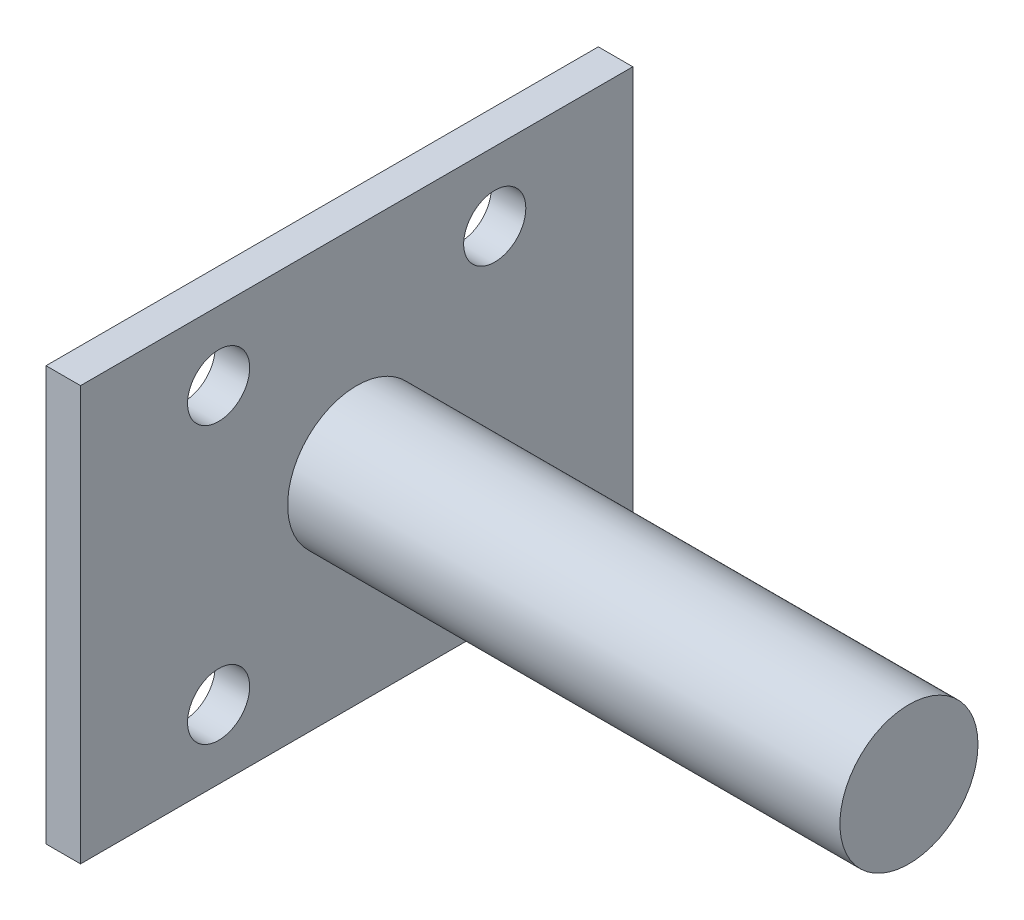
ISO-10303-21;
HEADER;
FILE_DESCRIPTION(('STEP AP214'),'2;1');
FILE_NAME('part.step','',(''),(''),'','','');
FILE_SCHEMA(('AUTOMOTIVE_DESIGN { 1 0 10303 214 1 1 1 1 }'));
ENDSEC;
DATA;
#1=APPLICATION_CONTEXT('core data for automotive mechanical design processes');
#2=APPLICATION_PROTOCOL_DEFINITION('international standard','automotive_design',2000,#1);
#3=PRODUCT_CONTEXT('',#1,'mechanical');
#4=PRODUCT('Part','Part','',(#3));
#5=PRODUCT_RELATED_PRODUCT_CATEGORY('part','',(#4));
#6=PRODUCT_DEFINITION_FORMATION('','',#4);
#7=PRODUCT_DEFINITION_CONTEXT('part definition',#1,'design');
#8=PRODUCT_DEFINITION('design','',#6,#7);
#9=PRODUCT_DEFINITION_SHAPE('','',#8);
#10=(LENGTH_UNIT() NAMED_UNIT(*) SI_UNIT(.MILLI.,.METRE.));
#11=(NAMED_UNIT(*) PLANE_ANGLE_UNIT() SI_UNIT($,.RADIAN.));
#12=(NAMED_UNIT(*) SI_UNIT($,.STERADIAN.) SOLID_ANGLE_UNIT());
#13=UNCERTAINTY_MEASURE_WITH_UNIT(LENGTH_MEASURE(1.E-05),#10,'distance_accuracy_value','');
#14=(GEOMETRIC_REPRESENTATION_CONTEXT(3) GLOBAL_UNCERTAINTY_ASSIGNED_CONTEXT((#13)) GLOBAL_UNIT_ASSIGNED_CONTEXT((#10,
#11,#12)) REPRESENTATION_CONTEXT('',''));
#15=CARTESIAN_POINT('',(0.,0.,0.));
#16=DIRECTION('',(0.,0.,1.));
#17=DIRECTION('',(1.,0.,0.));
#18=AXIS2_PLACEMENT_3D('',#15,#16,#17);
#19=CARTESIAN_POINT('',(2.5,-15.,20.));
#20=DIRECTION('',(0.,0.,-1.));
#21=DIRECTION('',(-1.,0.,0.));
#22=AXIS2_PLACEMENT_3D('',#19,#20,#21);
#23=PLANE('',#22);
#24=DIRECTION('',(0.,-1.,0.));
#25=VECTOR('',#24,1.);
#26=CARTESIAN_POINT('',(0.,-15.,20.));
#27=LINE('',#26,#25);
#28=CARTESIAN_POINT('',(0.,15.,20.));
#29=VERTEX_POINT('',#28);
#30=CARTESIAN_POINT('',(0.,-15.,20.));
#31=VERTEX_POINT('',#30);
#32=EDGE_CURVE('E116',#29,#31,#27,.T.);
#33=ORIENTED_EDGE('',*,*,#32,.T.);
#34=DIRECTION('',(-1.,0.,0.));
#35=VECTOR('',#34,1.);
#36=CARTESIAN_POINT('',(2.5,-15.,20.));
#37=LINE('',#36,#35);
#38=CARTESIAN_POINT('',(2.5,-15.,20.));
#39=VERTEX_POINT('',#38);
#40=EDGE_CURVE('E48',#39,#31,#37,.T.);
#41=ORIENTED_EDGE('',*,*,#40,.F.);
#42=DIRECTION('',(0.,-1.,0.));
#43=VECTOR('',#42,1.);
#44=CARTESIAN_POINT('',(2.5,-15.,20.));
#45=LINE('',#44,#43);
#46=CARTESIAN_POINT('',(2.5,15.,20.));
#47=VERTEX_POINT('',#46);
#48=EDGE_CURVE('E99',#47,#39,#45,.T.);
#49=ORIENTED_EDGE('',*,*,#48,.F.);
#50=DIRECTION('',(-1.,0.,0.));
#51=VECTOR('',#50,1.);
#52=CARTESIAN_POINT('',(2.5,15.,20.));
#53=LINE('',#52,#51);
#54=EDGE_CURVE('E112',#47,#29,#53,.T.);
#55=ORIENTED_EDGE('',*,*,#54,.T.);
#56=EDGE_LOOP('',(#33,#41,#49,#55));
#57=FACE_BOUND('',#56,.T.);
#58=ADVANCED_FACE('F45',(#57),#23,.F.);
#59=CARTESIAN_POINT('',(2.5,-15.,-20.));
#60=DIRECTION('',(0.,1.,0.));
#61=DIRECTION('',(0.,0.,1.));
#62=AXIS2_PLACEMENT_3D('',#59,#60,#61);
#63=PLANE('',#62);
#64=DIRECTION('',(0.,0.,-1.));
#65=VECTOR('',#64,1.);
#66=CARTESIAN_POINT('',(0.,-15.,-20.));
#67=LINE('',#66,#65);
#68=CARTESIAN_POINT('',(0.,-15.,-20.));
#69=VERTEX_POINT('',#68);
#70=EDGE_CURVE('E105',#31,#69,#67,.T.);
#71=ORIENTED_EDGE('',*,*,#70,.T.);
#72=DIRECTION('',(-1.,0.,0.));
#73=VECTOR('',#72,1.);
#74=CARTESIAN_POINT('',(2.5,-15.,-20.));
#75=LINE('',#74,#73);
#76=CARTESIAN_POINT('',(2.5,-15.,-20.));
#77=VERTEX_POINT('',#76);
#78=EDGE_CURVE('E103',#77,#69,#75,.T.);
#79=ORIENTED_EDGE('',*,*,#78,.F.);
#80=DIRECTION('',(0.,0.,-1.));
#81=VECTOR('',#80,1.);
#82=CARTESIAN_POINT('',(2.5,-15.,-20.));
#83=LINE('',#82,#81);
#84=EDGE_CURVE('E94',#39,#77,#83,.T.);
#85=ORIENTED_EDGE('',*,*,#84,.F.);
#86=ORIENTED_EDGE('',*,*,#40,.T.);
#87=EDGE_LOOP('',(#71,#79,#85,#86));
#88=FACE_BOUND('',#87,.T.);
#89=ADVANCED_FACE('F104',(#88),#63,.F.);
#90=CARTESIAN_POINT('',(2.5,-15.,-20.));
#91=DIRECTION('',(0.,0.,1.));
#92=DIRECTION('',(0.,-1.,0.));
#93=AXIS2_PLACEMENT_3D('',#90,#91,#92);
#94=PLANE('',#93);
#95=DIRECTION('',(0.,1.,0.));
#96=VECTOR('',#95,1.);
#97=CARTESIAN_POINT('',(0.,-15.,-20.));
#98=LINE('',#97,#96);
#99=CARTESIAN_POINT('',(0.,15.,-20.));
#100=VERTEX_POINT('',#99);
#101=EDGE_CURVE('E80',#69,#100,#98,.T.);
#102=ORIENTED_EDGE('',*,*,#101,.T.);
#103=DIRECTION('',(-1.,0.,0.));
#104=VECTOR('',#103,1.);
#105=CARTESIAN_POINT('',(2.5,15.,-20.));
#106=LINE('',#105,#104);
#107=CARTESIAN_POINT('',(2.5,15.,-20.));
#108=VERTEX_POINT('',#107);
#109=EDGE_CURVE('E107',#108,#100,#106,.T.);
#110=ORIENTED_EDGE('',*,*,#109,.F.);
#111=DIRECTION('',(0.,1.,0.));
#112=VECTOR('',#111,1.);
#113=CARTESIAN_POINT('',(2.5,-15.,-20.));
#114=LINE('',#113,#112);
#115=EDGE_CURVE('E97',#77,#108,#114,.T.);
#116=ORIENTED_EDGE('',*,*,#115,.F.);
#117=ORIENTED_EDGE('',*,*,#78,.T.);
#118=EDGE_LOOP('',(#102,#110,#116,#117));
#119=FACE_BOUND('',#118,.T.);
#120=ADVANCED_FACE('F108',(#119),#94,.F.);
#121=CARTESIAN_POINT('',(2.5,15.,-20.));
#122=DIRECTION('',(0.,-1.,0.));
#123=DIRECTION('',(0.,0.,-1.));
#124=AXIS2_PLACEMENT_3D('',#121,#122,#123);
#125=PLANE('',#124);
#126=DIRECTION('',(0.,0.,1.));
#127=VECTOR('',#126,1.);
#128=CARTESIAN_POINT('',(0.,15.,-20.));
#129=LINE('',#128,#127);
#130=EDGE_CURVE('E86',#100,#29,#129,.T.);
#131=ORIENTED_EDGE('',*,*,#130,.T.);
#132=ORIENTED_EDGE('',*,*,#54,.F.);
#133=DIRECTION('',(0.,0.,1.));
#134=VECTOR('',#133,1.);
#135=CARTESIAN_POINT('',(2.5,15.,-20.));
#136=LINE('',#135,#134);
#137=EDGE_CURVE('E63',#108,#47,#136,.T.);
#138=ORIENTED_EDGE('',*,*,#137,.F.);
#139=ORIENTED_EDGE('',*,*,#109,.T.);
#140=EDGE_LOOP('',(#131,#132,#138,#139));
#141=FACE_BOUND('',#140,.T.);
#142=ADVANCED_FACE('F130',(#141),#125,.F.);
#143=CARTESIAN_POINT('',(2.5,0.,0.));
#144=DIRECTION('',(1.,0.,0.));
#145=DIRECTION('',(0.,0.,-1.));
#146=AXIS2_PLACEMENT_3D('',#143,#144,#145);
#147=PLANE('',#146);
#148=CARTESIAN_POINT('',(2.5,-9.99999999999999,10.));
#149=DIRECTION('',(1.,0.,0.));
#150=DIRECTION('',(0.,0.,-1.));
#151=AXIS2_PLACEMENT_3D('',#148,#149,#150);
#152=CIRCLE('',#151,2.25);
#153=CARTESIAN_POINT('',(2.5,-9.99999999999999,7.75000000000001));
#154=VERTEX_POINT('',#153);
#155=EDGE_CURVE('E145',#154,#154,#152,.T.);
#156=ORIENTED_EDGE('',*,*,#155,.F.);
#157=EDGE_LOOP('',(#156));
#158=FACE_BOUND('',#157,.T.);
#159=CARTESIAN_POINT('',(2.5,10.,-10.));
#160=DIRECTION('',(1.,0.,0.));
#161=DIRECTION('',(0.,0.,-1.));
#162=AXIS2_PLACEMENT_3D('',#159,#160,#161);
#163=CIRCLE('',#162,2.25);
#164=CARTESIAN_POINT('',(2.5,10.,-12.25));
#165=VERTEX_POINT('',#164);
#166=EDGE_CURVE('E153',#165,#165,#163,.T.);
#167=ORIENTED_EDGE('',*,*,#166,.F.);
#168=EDGE_LOOP('',(#167));
#169=FACE_BOUND('',#168,.T.);
#170=CARTESIAN_POINT('',(2.5,-9.99999999999999,-10.));
#171=DIRECTION('',(1.,0.,0.));
#172=DIRECTION('',(0.,0.,-1.));
#173=AXIS2_PLACEMENT_3D('',#170,#171,#172);
#174=CIRCLE('',#173,2.25);
#175=CARTESIAN_POINT('',(2.5,-9.99999999999999,-12.25));
#176=VERTEX_POINT('',#175);
#177=EDGE_CURVE('E154',#176,#176,#174,.T.);
#178=ORIENTED_EDGE('',*,*,#177,.F.);
#179=EDGE_LOOP('',(#178));
#180=FACE_BOUND('',#179,.T.);
#181=CARTESIAN_POINT('',(2.5,10.,10.));
#182=DIRECTION('',(1.,0.,0.));
#183=DIRECTION('',(0.,0.,-1.));
#184=AXIS2_PLACEMENT_3D('',#181,#182,#183);
#185=CIRCLE('',#184,2.25);
#186=CARTESIAN_POINT('',(2.5,10.,7.75000000000001));
#187=VERTEX_POINT('',#186);
#188=EDGE_CURVE('E141',#187,#187,#185,.T.);
#189=ORIENTED_EDGE('',*,*,#188,.F.);
#190=EDGE_LOOP('',(#189));
#191=FACE_BOUND('',#190,.T.);
#192=CARTESIAN_POINT('',(2.5,0.,0.));
#193=DIRECTION('',(1.,0.,0.));
#194=DIRECTION('',(0.,0.,-1.));
#195=AXIS2_PLACEMENT_3D('',#192,#193,#194);
#196=CIRCLE('',#195,5.);
#197=CARTESIAN_POINT('',(2.5,0.,-5.));
#198=VERTEX_POINT('',#197);
#199=EDGE_CURVE('E11',#198,#198,#196,.T.);
#200=ORIENTED_EDGE('',*,*,#199,.F.);
#201=EDGE_LOOP('',(#200));
#202=FACE_BOUND('',#201,.T.);
#203=ORIENTED_EDGE('',*,*,#48,.T.);
#204=ORIENTED_EDGE('',*,*,#84,.T.);
#205=ORIENTED_EDGE('',*,*,#115,.T.);
#206=ORIENTED_EDGE('',*,*,#137,.T.);
#207=EDGE_LOOP('',(#203,#204,#205,#206));
#208=FACE_BOUND('',#207,.T.);
#209=ADVANCED_FACE('F95',(#158,#169,#180,#191,#202,#208),#147,.T.);
#210=CARTESIAN_POINT('',(0.,0.,0.));
#211=DIRECTION('',(1.,0.,0.));
#212=DIRECTION('',(0.,0.,-1.));
#213=AXIS2_PLACEMENT_3D('',#210,#211,#212);
#214=PLANE('',#213);
#215=CARTESIAN_POINT('',(0.,-9.99999999999999,10.));
#216=DIRECTION('',(1.,0.,0.));
#217=DIRECTION('',(0.,0.,-1.));
#218=AXIS2_PLACEMENT_3D('',#215,#216,#217);
#219=CIRCLE('',#218,2.25);
#220=CARTESIAN_POINT('',(0.,-9.99999999999999,7.75000000000001));
#221=VERTEX_POINT('',#220);
#222=EDGE_CURVE('E158',#221,#221,#219,.T.);
#223=ORIENTED_EDGE('',*,*,#222,.T.);
#224=EDGE_LOOP('',(#223));
#225=FACE_BOUND('',#224,.T.);
#226=CARTESIAN_POINT('',(0.,10.,-10.));
#227=DIRECTION('',(1.,0.,0.));
#228=DIRECTION('',(0.,0.,-1.));
#229=AXIS2_PLACEMENT_3D('',#226,#227,#228);
#230=CIRCLE('',#229,2.25);
#231=CARTESIAN_POINT('',(0.,10.,-12.25));
#232=VERTEX_POINT('',#231);
#233=EDGE_CURVE('E149',#232,#232,#230,.T.);
#234=ORIENTED_EDGE('',*,*,#233,.T.);
#235=EDGE_LOOP('',(#234));
#236=FACE_BOUND('',#235,.T.);
#237=CARTESIAN_POINT('',(0.,-9.99999999999999,-10.));
#238=DIRECTION('',(1.,0.,0.));
#239=DIRECTION('',(0.,0.,-1.));
#240=AXIS2_PLACEMENT_3D('',#237,#238,#239);
#241=CIRCLE('',#240,2.25);
#242=CARTESIAN_POINT('',(0.,-9.99999999999999,-12.25));
#243=VERTEX_POINT('',#242);
#244=EDGE_CURVE('E165',#243,#243,#241,.T.);
#245=ORIENTED_EDGE('',*,*,#244,.T.);
#246=EDGE_LOOP('',(#245));
#247=FACE_BOUND('',#246,.T.);
#248=CARTESIAN_POINT('',(0.,10.,10.));
#249=DIRECTION('',(1.,0.,0.));
#250=DIRECTION('',(0.,0.,-1.));
#251=AXIS2_PLACEMENT_3D('',#248,#249,#250);
#252=CIRCLE('',#251,2.25);
#253=CARTESIAN_POINT('',(0.,10.,7.75000000000001));
#254=VERTEX_POINT('',#253);
#255=EDGE_CURVE('E140',#254,#254,#252,.T.);
#256=ORIENTED_EDGE('',*,*,#255,.T.);
#257=EDGE_LOOP('',(#256));
#258=FACE_BOUND('',#257,.T.);
#259=ORIENTED_EDGE('',*,*,#32,.F.);
#260=ORIENTED_EDGE('',*,*,#130,.F.);
#261=ORIENTED_EDGE('',*,*,#101,.F.);
#262=ORIENTED_EDGE('',*,*,#70,.F.);
#263=EDGE_LOOP('',(#259,#260,#261,#262));
#264=FACE_BOUND('',#263,.T.);
#265=ADVANCED_FACE('F133',(#225,#236,#247,#258,#264),#214,.F.);
#266=CARTESIAN_POINT('',(42.5,0.,0.));
#267=DIRECTION('',(-1.,0.,0.));
#268=DIRECTION('',(0.,0.,1.));
#269=AXIS2_PLACEMENT_3D('',#266,#267,#268);
#270=CYLINDRICAL_SURFACE('',#269,5.);
#271=CARTESIAN_POINT('',(42.5,0.,0.));
#272=DIRECTION('',(1.,0.,0.));
#273=DIRECTION('',(0.,0.,-1.));
#274=AXIS2_PLACEMENT_3D('',#271,#272,#273);
#275=CIRCLE('',#274,5.);
#276=CARTESIAN_POINT('',(42.5,0.,-5.));
#277=VERTEX_POINT('',#276);
#278=EDGE_CURVE('E120',#277,#277,#275,.T.);
#279=ORIENTED_EDGE('',*,*,#278,.F.);
#280=EDGE_LOOP('',(#279));
#281=FACE_BOUND('',#280,.T.);
#282=ORIENTED_EDGE('',*,*,#199,.T.);
#283=EDGE_LOOP('',(#282));
#284=FACE_BOUND('',#283,.T.);
#285=ADVANCED_FACE('F183',(#281,#284),#270,.T.);
#286=CARTESIAN_POINT('',(42.5,0.,0.));
#287=DIRECTION('',(1.,0.,0.));
#288=DIRECTION('',(0.,0.,-1.));
#289=AXIS2_PLACEMENT_3D('',#286,#287,#288);
#290=PLANE('',#289);
#291=ORIENTED_EDGE('',*,*,#278,.T.);
#292=EDGE_LOOP('',(#291));
#293=FACE_BOUND('',#292,.T.);
#294=ADVANCED_FACE('F185',(#293),#290,.T.);
#295=CARTESIAN_POINT('',(0.,10.,10.));
#296=DIRECTION('',(1.,0.,0.));
#297=DIRECTION('',(0.,0.,-1.));
#298=AXIS2_PLACEMENT_3D('',#295,#296,#297);
#299=CYLINDRICAL_SURFACE('',#298,2.25);
#300=ORIENTED_EDGE('',*,*,#255,.F.);
#301=EDGE_LOOP('',(#300));
#302=FACE_BOUND('',#301,.T.);
#303=ORIENTED_EDGE('',*,*,#188,.T.);
#304=EDGE_LOOP('',(#303));
#305=FACE_BOUND('',#304,.T.);
#306=ADVANCED_FACE('F192',(#302,#305),#299,.F.);
#307=CARTESIAN_POINT('',(0.,-9.99999999999999,-10.));
#308=DIRECTION('',(1.,0.,0.));
#309=DIRECTION('',(0.,0.,-1.));
#310=AXIS2_PLACEMENT_3D('',#307,#308,#309);
#311=CYLINDRICAL_SURFACE('',#310,2.25);
#312=ORIENTED_EDGE('',*,*,#244,.F.);
#313=EDGE_LOOP('',(#312));
#314=FACE_BOUND('',#313,.T.);
#315=ORIENTED_EDGE('',*,*,#177,.T.);
#316=EDGE_LOOP('',(#315));
#317=FACE_BOUND('',#316,.T.);
#318=ADVANCED_FACE('F173',(#314,#317),#311,.F.);
#319=CARTESIAN_POINT('',(0.,10.,-10.));
#320=DIRECTION('',(1.,0.,0.));
#321=DIRECTION('',(0.,0.,-1.));
#322=AXIS2_PLACEMENT_3D('',#319,#320,#321);
#323=CYLINDRICAL_SURFACE('',#322,2.25);
#324=ORIENTED_EDGE('',*,*,#233,.F.);
#325=EDGE_LOOP('',(#324));
#326=FACE_BOUND('',#325,.T.);
#327=ORIENTED_EDGE('',*,*,#166,.T.);
#328=EDGE_LOOP('',(#327));
#329=FACE_BOUND('',#328,.T.);
#330=ADVANCED_FACE('F260',(#326,#329),#323,.F.);
#331=CARTESIAN_POINT('',(0.,-9.99999999999999,10.));
#332=DIRECTION('',(1.,0.,0.));
#333=DIRECTION('',(0.,0.,-1.));
#334=AXIS2_PLACEMENT_3D('',#331,#332,#333);
#335=CYLINDRICAL_SURFACE('',#334,2.25);
#336=ORIENTED_EDGE('',*,*,#222,.F.);
#337=EDGE_LOOP('',(#336));
#338=FACE_BOUND('',#337,.T.);
#339=ORIENTED_EDGE('',*,*,#155,.T.);
#340=EDGE_LOOP('',(#339));
#341=FACE_BOUND('',#340,.T.);
#342=ADVANCED_FACE('F269',(#338,#341),#335,.F.);
#343=CLOSED_SHELL('',(#58,#89,#120,#142,#209,#265,#285,#294,#306,#318,#330,#342));
#344=MANIFOLD_SOLID_BREP('B2',#343);
#345=ADVANCED_BREP_SHAPE_REPRESENTATION('',(#18,#344),#14);
#346=SHAPE_DEFINITION_REPRESENTATION(#9,#345);
ENDSEC;
END-ISO-10303-21;
